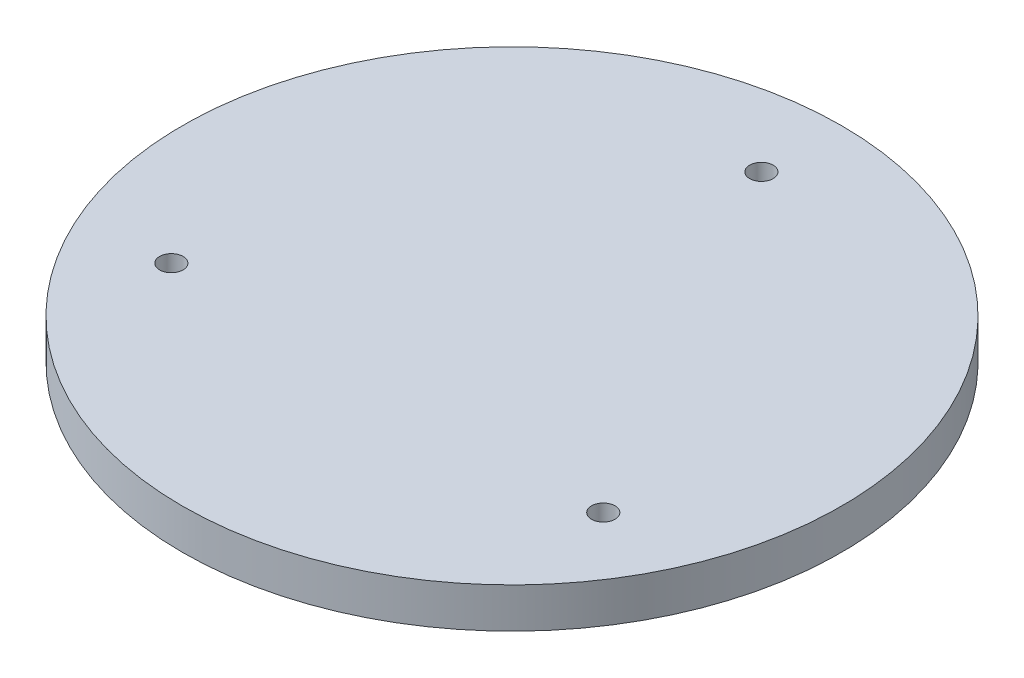
ISO-10303-21;
HEADER;
FILE_DESCRIPTION(('STEP AP214'),'2;1');
FILE_NAME('part.step','',(''),(''),'','','');
FILE_SCHEMA(('AUTOMOTIVE_DESIGN { 1 0 10303 214 1 1 1 1 }'));
ENDSEC;
DATA;
#1=APPLICATION_CONTEXT('core data for automotive mechanical design processes');
#2=APPLICATION_PROTOCOL_DEFINITION('international standard','automotive_design',2000,#1);
#3=PRODUCT_CONTEXT('',#1,'mechanical');
#4=PRODUCT('Part','Part','',(#3));
#5=PRODUCT_RELATED_PRODUCT_CATEGORY('part','',(#4));
#6=PRODUCT_DEFINITION_FORMATION('','',#4);
#7=PRODUCT_DEFINITION_CONTEXT('part definition',#1,'design');
#8=PRODUCT_DEFINITION('design','',#6,#7);
#9=PRODUCT_DEFINITION_SHAPE('','',#8);
#10=(LENGTH_UNIT() NAMED_UNIT(*) SI_UNIT(.MILLI.,.METRE.));
#11=(NAMED_UNIT(*) PLANE_ANGLE_UNIT() SI_UNIT($,.RADIAN.));
#12=(NAMED_UNIT(*) SI_UNIT($,.STERADIAN.) SOLID_ANGLE_UNIT());
#13=UNCERTAINTY_MEASURE_WITH_UNIT(LENGTH_MEASURE(1.E-05),#10,'distance_accuracy_value','');
#14=(GEOMETRIC_REPRESENTATION_CONTEXT(3) GLOBAL_UNCERTAINTY_ASSIGNED_CONTEXT((#13)) GLOBAL_UNIT_ASSIGNED_CONTEXT((#10,
#11,#12)) REPRESENTATION_CONTEXT('',''));
#15=CARTESIAN_POINT('',(0.,0.,0.));
#16=DIRECTION('',(0.,0.,1.));
#17=DIRECTION('',(1.,0.,0.));
#18=AXIS2_PLACEMENT_3D('',#15,#16,#17);
#19=CARTESIAN_POINT('',(0.,14.2875,0.));
#20=DIRECTION('',(0.,-1.,0.));
#21=DIRECTION('',(0.,0.,-1.));
#22=AXIS2_PLACEMENT_3D('',#19,#20,#21);
#23=CYLINDRICAL_SURFACE('',#22,117.475);
#24=CARTESIAN_POINT('',(0.,14.2875,0.));
#25=DIRECTION('',(0.,1.,0.));
#26=DIRECTION('',(0.,0.,1.));
#27=AXIS2_PLACEMENT_3D('',#24,#25,#26);
#28=CIRCLE('',#27,117.475);
#29=CARTESIAN_POINT('',(0.,14.2875,117.475));
#30=VERTEX_POINT('',#29);
#31=EDGE_CURVE('E10',#30,#30,#28,.T.);
#32=ORIENTED_EDGE('',*,*,#31,.F.);
#33=EDGE_LOOP('',(#32));
#34=FACE_BOUND('',#33,.T.);
#35=CARTESIAN_POINT('',(0.,0.,0.));
#36=DIRECTION('',(0.,1.,0.));
#37=DIRECTION('',(0.,0.,1.));
#38=AXIS2_PLACEMENT_3D('',#35,#36,#37);
#39=CIRCLE('',#38,117.475);
#40=CARTESIAN_POINT('',(0.,0.,117.475));
#41=VERTEX_POINT('',#40);
#42=EDGE_CURVE('E38',#41,#41,#39,.T.);
#43=ORIENTED_EDGE('',*,*,#42,.T.);
#44=EDGE_LOOP('',(#43));
#45=FACE_BOUND('',#44,.T.);
#46=ADVANCED_FACE('F35',(#34,#45),#23,.T.);
#47=CARTESIAN_POINT('',(0.,14.2875,0.));
#48=DIRECTION('',(0.,1.,0.));
#49=DIRECTION('',(0.,0.,1.));
#50=AXIS2_PLACEMENT_3D('',#47,#48,#49);
#51=PLANE('',#50);
#52=CARTESIAN_POINT('',(0.,14.2875,-88.9));
#53=DIRECTION('',(0.,1.,0.));
#54=DIRECTION('',(0.,0.,1.));
#55=AXIS2_PLACEMENT_3D('',#52,#53,#54);
#56=CIRCLE('',#55,4.1783);
#57=CARTESIAN_POINT('',(0.,14.2875,-84.7217));
#58=VERTEX_POINT('',#57);
#59=EDGE_CURVE('E59',#58,#58,#56,.T.);
#60=ORIENTED_EDGE('',*,*,#59,.F.);
#61=EDGE_LOOP('',(#60));
#62=FACE_BOUND('',#61,.T.);
#63=CARTESIAN_POINT('',(76.9896583964423,14.2875,44.4499999999967));
#64=DIRECTION('',(0.,1.,0.));
#65=DIRECTION('',(0.,0.,1.));
#66=AXIS2_PLACEMENT_3D('',#63,#64,#65);
#67=CIRCLE('',#66,4.17830000000489);
#68=CARTESIAN_POINT('',(76.9896583964423,14.2875,48.6283000000016));
#69=VERTEX_POINT('',#68);
#70=EDGE_CURVE('E53',#69,#69,#67,.T.);
#71=ORIENTED_EDGE('',*,*,#70,.F.);
#72=EDGE_LOOP('',(#71));
#73=FACE_BOUND('',#72,.T.);
#74=CARTESIAN_POINT('',(-76.9896583964309,14.2875,44.4500000000033));
#75=DIRECTION('',(0.,1.,0.));
#76=DIRECTION('',(0.,0.,1.));
#77=AXIS2_PLACEMENT_3D('',#74,#75,#76);
#78=CIRCLE('',#77,4.1783000000072);
#79=CARTESIAN_POINT('',(-76.9896583964309,14.2875,48.6283000000105));
#80=VERTEX_POINT('',#79);
#81=EDGE_CURVE('E47',#80,#80,#78,.T.);
#82=ORIENTED_EDGE('',*,*,#81,.F.);
#83=EDGE_LOOP('',(#82));
#84=FACE_BOUND('',#83,.T.);
#85=ORIENTED_EDGE('',*,*,#31,.T.);
#86=EDGE_LOOP('',(#85));
#87=FACE_BOUND('',#86,.T.);
#88=ADVANCED_FACE('F75',(#62,#73,#84,#87),#51,.T.);
#89=CARTESIAN_POINT('',(0.,0.,0.));
#90=DIRECTION('',(0.,1.,0.));
#91=DIRECTION('',(0.,0.,1.));
#92=AXIS2_PLACEMENT_3D('',#89,#90,#91);
#93=PLANE('',#92);
#94=CARTESIAN_POINT('',(0.,0.,-88.9));
#95=DIRECTION('',(0.,1.,0.));
#96=DIRECTION('',(0.,0.,1.));
#97=AXIS2_PLACEMENT_3D('',#94,#95,#96);
#98=CIRCLE('',#97,4.1783);
#99=CARTESIAN_POINT('',(0.,0.,-84.7217));
#100=VERTEX_POINT('',#99);
#101=EDGE_CURVE('E45',#100,#100,#98,.T.);
#102=ORIENTED_EDGE('',*,*,#101,.T.);
#103=EDGE_LOOP('',(#102));
#104=FACE_BOUND('',#103,.T.);
#105=CARTESIAN_POINT('',(76.9896583964423,0.,44.4499999999967));
#106=DIRECTION('',(0.,1.,0.));
#107=DIRECTION('',(0.,0.,1.));
#108=AXIS2_PLACEMENT_3D('',#105,#106,#107);
#109=CIRCLE('',#108,4.17830000000489);
#110=CARTESIAN_POINT('',(76.9896583964423,0.,48.6283000000016));
#111=VERTEX_POINT('',#110);
#112=EDGE_CURVE('E56',#111,#111,#109,.T.);
#113=ORIENTED_EDGE('',*,*,#112,.T.);
#114=EDGE_LOOP('',(#113));
#115=FACE_BOUND('',#114,.T.);
#116=CARTESIAN_POINT('',(-76.9896583964309,0.,44.4500000000033));
#117=DIRECTION('',(0.,1.,0.));
#118=DIRECTION('',(0.,0.,1.));
#119=AXIS2_PLACEMENT_3D('',#116,#117,#118);
#120=CIRCLE('',#119,4.1783000000072);
#121=CARTESIAN_POINT('',(-76.9896583964309,0.,48.6283000000105));
#122=VERTEX_POINT('',#121);
#123=EDGE_CURVE('E50',#122,#122,#120,.T.);
#124=ORIENTED_EDGE('',*,*,#123,.T.);
#125=EDGE_LOOP('',(#124));
#126=FACE_BOUND('',#125,.T.);
#127=ORIENTED_EDGE('',*,*,#42,.F.);
#128=EDGE_LOOP('',(#127));
#129=FACE_BOUND('',#128,.T.);
#130=ADVANCED_FACE('F65',(#104,#115,#126,#129),#93,.F.);
#131=CARTESIAN_POINT('',(-76.9896583964309,0.,44.4500000000033));
#132=DIRECTION('',(0.,1.,0.));
#133=DIRECTION('',(0.,0.,1.));
#134=AXIS2_PLACEMENT_3D('',#131,#132,#133);
#135=CYLINDRICAL_SURFACE('',#134,4.1783000000072);
#136=ORIENTED_EDGE('',*,*,#123,.F.);
#137=EDGE_LOOP('',(#136));
#138=FACE_BOUND('',#137,.T.);
#139=ORIENTED_EDGE('',*,*,#81,.T.);
#140=EDGE_LOOP('',(#139));
#141=FACE_BOUND('',#140,.T.);
#142=ADVANCED_FACE('F83',(#138,#141),#135,.F.);
#143=CARTESIAN_POINT('',(76.9896583964423,0.,44.4499999999967));
#144=DIRECTION('',(0.,1.,0.));
#145=DIRECTION('',(0.,0.,1.));
#146=AXIS2_PLACEMENT_3D('',#143,#144,#145);
#147=CYLINDRICAL_SURFACE('',#146,4.17830000000489);
#148=ORIENTED_EDGE('',*,*,#112,.F.);
#149=EDGE_LOOP('',(#148));
#150=FACE_BOUND('',#149,.T.);
#151=ORIENTED_EDGE('',*,*,#70,.T.);
#152=EDGE_LOOP('',(#151));
#153=FACE_BOUND('',#152,.T.);
#154=ADVANCED_FACE('F71',(#150,#153),#147,.F.);
#155=CARTESIAN_POINT('',(0.,0.,-88.9));
#156=DIRECTION('',(0.,1.,0.));
#157=DIRECTION('',(0.,0.,1.));
#158=AXIS2_PLACEMENT_3D('',#155,#156,#157);
#159=CYLINDRICAL_SURFACE('',#158,4.1783);
#160=ORIENTED_EDGE('',*,*,#101,.F.);
#161=EDGE_LOOP('',(#160));
#162=FACE_BOUND('',#161,.T.);
#163=ORIENTED_EDGE('',*,*,#59,.T.);
#164=EDGE_LOOP('',(#163));
#165=FACE_BOUND('',#164,.T.);
#166=ADVANCED_FACE('F68',(#162,#165),#159,.F.);
#167=CLOSED_SHELL('',(#46,#88,#130,#142,#154,#166));
#168=MANIFOLD_SOLID_BREP('B2',#167);
#169=ADVANCED_BREP_SHAPE_REPRESENTATION('',(#18,#168),#14);
#170=SHAPE_DEFINITION_REPRESENTATION(#9,#169);
ENDSEC;
END-ISO-10303-21;
